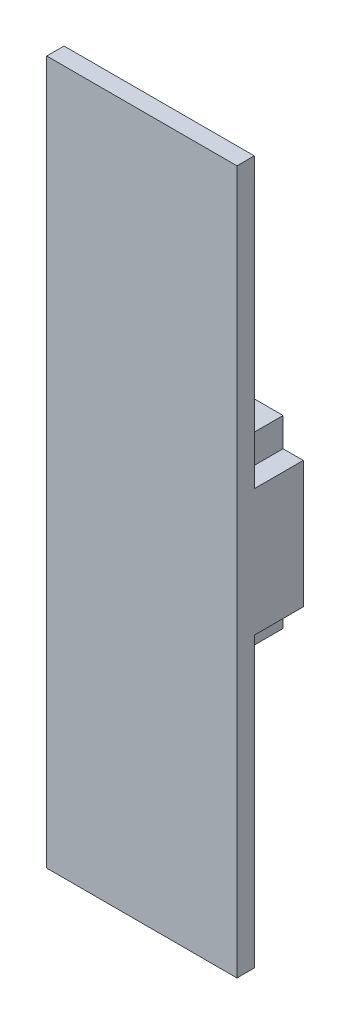
ISO-10303-21;
HEADER;
FILE_DESCRIPTION(('STEP AP214'),'2;1');
FILE_NAME('part.step','',(''),(''),'','','');
FILE_SCHEMA(('AUTOMOTIVE_DESIGN { 1 0 10303 214 1 1 1 1 }'));
ENDSEC;
DATA;
#1=APPLICATION_CONTEXT('core data for automotive mechanical design processes');
#2=APPLICATION_PROTOCOL_DEFINITION('international standard','automotive_design',2000,#1);
#3=PRODUCT_CONTEXT('',#1,'mechanical');
#4=PRODUCT('Part','Part','',(#3));
#5=PRODUCT_RELATED_PRODUCT_CATEGORY('part','',(#4));
#6=PRODUCT_DEFINITION_FORMATION('','',#4);
#7=PRODUCT_DEFINITION_CONTEXT('part definition',#1,'design');
#8=PRODUCT_DEFINITION('design','',#6,#7);
#9=PRODUCT_DEFINITION_SHAPE('','',#8);
#10=(LENGTH_UNIT() NAMED_UNIT(*) SI_UNIT(.MILLI.,.METRE.));
#11=(NAMED_UNIT(*) PLANE_ANGLE_UNIT() SI_UNIT($,.RADIAN.));
#12=(NAMED_UNIT(*) SI_UNIT($,.STERADIAN.) SOLID_ANGLE_UNIT());
#13=UNCERTAINTY_MEASURE_WITH_UNIT(LENGTH_MEASURE(1.E-05),#10,'distance_accuracy_value','');
#14=(GEOMETRIC_REPRESENTATION_CONTEXT(3) GLOBAL_UNCERTAINTY_ASSIGNED_CONTEXT((#13)) GLOBAL_UNIT_ASSIGNED_CONTEXT((#10,
#11,#12)) REPRESENTATION_CONTEXT('',''));
#15=CARTESIAN_POINT('',(0.,0.,0.));
#16=DIRECTION('',(0.,0.,1.));
#17=DIRECTION('',(1.,0.,0.));
#18=AXIS2_PLACEMENT_3D('',#15,#16,#17);
#19=CARTESIAN_POINT('',(0.,11.,2.5));
#20=DIRECTION('',(0.,1.,0.));
#21=DIRECTION('',(0.,0.,1.));
#22=AXIS2_PLACEMENT_3D('',#19,#20,#21);
#23=PLANE('',#22);
#24=DIRECTION('',(0.,0.,-1.));
#25=VECTOR('',#24,1.);
#26=CARTESIAN_POINT('',(-16.5,11.,2.5));
#27=LINE('',#26,#25);
#28=CARTESIAN_POINT('',(-16.5,11.,6.));
#29=VERTEX_POINT('',#28);
#30=CARTESIAN_POINT('',(-16.5,11.,-2.5));
#31=VERTEX_POINT('',#30);
#32=EDGE_CURVE('E41',#29,#31,#27,.T.);
#33=ORIENTED_EDGE('',*,*,#32,.F.);
#34=DIRECTION('',(-1.,0.,0.));
#35=VECTOR('',#34,1.);
#36=CARTESIAN_POINT('',(-16.5,11.,6.));
#37=LINE('',#36,#35);
#38=CARTESIAN_POINT('',(16.5,11.,6.));
#39=VERTEX_POINT('',#38);
#40=EDGE_CURVE('E709',#39,#29,#37,.T.);
#41=ORIENTED_EDGE('',*,*,#40,.F.);
#42=DIRECTION('',(0.,0.,-1.));
#43=VECTOR('',#42,1.);
#44=CARTESIAN_POINT('',(16.5,11.,2.5));
#45=LINE('',#44,#43);
#46=CARTESIAN_POINT('',(16.5,11.,-2.5));
#47=VERTEX_POINT('',#46);
#48=EDGE_CURVE('E258',#39,#47,#45,.T.);
#49=ORIENTED_EDGE('',*,*,#48,.T.);
#50=DIRECTION('',(1.,0.,0.));
#51=VECTOR('',#50,1.);
#52=CARTESIAN_POINT('',(0.,11.,-2.5));
#53=LINE('',#52,#51);
#54=CARTESIAN_POINT('',(13.,11.,-2.5));
#55=VERTEX_POINT('',#54);
#56=EDGE_CURVE('E206',#55,#47,#53,.T.);
#57=ORIENTED_EDGE('',*,*,#56,.F.);
#58=DIRECTION('',(0.,0.,-1.));
#59=VECTOR('',#58,1.);
#60=CARTESIAN_POINT('',(13.,11.,2.5));
#61=LINE('',#60,#59);
#62=CARTESIAN_POINT('',(13.,11.,2.5));
#63=VERTEX_POINT('',#62);
#64=EDGE_CURVE('E256',#63,#55,#61,.T.);
#65=ORIENTED_EDGE('',*,*,#64,.F.);
#66=DIRECTION('',(-1.,0.,0.));
#67=VECTOR('',#66,1.);
#68=CARTESIAN_POINT('',(-16.5,11.,2.5));
#69=LINE('',#68,#67);
#70=CARTESIAN_POINT('',(4.99999999999999,11.,2.5));
#71=VERTEX_POINT('',#70);
#72=EDGE_CURVE('E11',#63,#71,#69,.T.);
#73=ORIENTED_EDGE('',*,*,#72,.T.);
#74=DIRECTION('',(0.,0.,-1.));
#75=VECTOR('',#74,1.);
#76=CARTESIAN_POINT('',(4.99999999999999,11.,2.5));
#77=LINE('',#76,#75);
#78=CARTESIAN_POINT('',(4.99999999999999,11.,-2.5));
#79=VERTEX_POINT('',#78);
#80=EDGE_CURVE('E249',#71,#79,#77,.T.);
#81=ORIENTED_EDGE('',*,*,#80,.T.);
#82=CARTESIAN_POINT('',(-5.,11.,-2.5));
#83=VERTEX_POINT('',#82);
#84=EDGE_CURVE('E205',#83,#79,#53,.T.);
#85=ORIENTED_EDGE('',*,*,#84,.F.);
#86=DIRECTION('',(0.,0.,-1.));
#87=VECTOR('',#86,1.);
#88=CARTESIAN_POINT('',(-5.,11.,2.5));
#89=LINE('',#88,#87);
#90=CARTESIAN_POINT('',(-5.,11.,2.5));
#91=VERTEX_POINT('',#90);
#92=EDGE_CURVE('E188',#91,#83,#89,.T.);
#93=ORIENTED_EDGE('',*,*,#92,.F.);
#94=CARTESIAN_POINT('',(-13.,11.,2.5));
#95=VERTEX_POINT('',#94);
#96=EDGE_CURVE('E47',#91,#95,#69,.T.);
#97=ORIENTED_EDGE('',*,*,#96,.T.);
#98=DIRECTION('',(0.,0.,-1.));
#99=VECTOR('',#98,1.);
#100=CARTESIAN_POINT('',(-13.,11.,2.5));
#101=LINE('',#100,#99);
#102=CARTESIAN_POINT('',(-13.,11.,-2.5));
#103=VERTEX_POINT('',#102);
#104=EDGE_CURVE('E128',#95,#103,#101,.T.);
#105=ORIENTED_EDGE('',*,*,#104,.T.);
#106=EDGE_CURVE('E200',#31,#103,#53,.T.);
#107=ORIENTED_EDGE('',*,*,#106,.F.);
#108=EDGE_LOOP('',(#33,#41,#49,#57,#65,#73,#81,#85,#93,#97,#105,#107));
#109=FACE_BOUND('',#108,.T.);
#110=ADVANCED_FACE('F37',(#109),#23,.T.);
#111=CARTESIAN_POINT('',(0.,0.,2.5));
#112=DIRECTION('',(0.,0.,1.));
#113=DIRECTION('',(1.,0.,0.));
#114=AXIS2_PLACEMENT_3D('',#111,#112,#113);
#115=PLANE('',#114);
#116=ORIENTED_EDGE('',*,*,#72,.F.);
#117=DIRECTION('',(0.,-1.,0.));
#118=VECTOR('',#117,1.);
#119=CARTESIAN_POINT('',(13.,0.,2.5));
#120=LINE('',#119,#118);
#121=CARTESIAN_POINT('',(13.,16.,2.5));
#122=VERTEX_POINT('',#121);
#123=EDGE_CURVE('E309',#122,#63,#120,.T.);
#124=ORIENTED_EDGE('',*,*,#123,.F.);
#125=DIRECTION('',(-1.,0.,0.));
#126=VECTOR('',#125,1.);
#127=CARTESIAN_POINT('',(0.,16.,2.5));
#128=LINE('',#127,#126);
#129=CARTESIAN_POINT('',(4.99999999999999,16.,2.5));
#130=VERTEX_POINT('',#129);
#131=EDGE_CURVE('E312',#122,#130,#128,.T.);
#132=ORIENTED_EDGE('',*,*,#131,.T.);
#133=DIRECTION('',(0.,-1.,0.));
#134=VECTOR('',#133,1.);
#135=CARTESIAN_POINT('',(5.,0.,2.5));
#136=LINE('',#135,#134);
#137=EDGE_CURVE('E193',#130,#71,#136,.T.);
#138=ORIENTED_EDGE('',*,*,#137,.T.);
#139=EDGE_LOOP('',(#116,#124,#132,#138));
#140=FACE_BOUND('',#139,.T.);
#141=ADVANCED_FACE('F316',(#140),#115,.T.);
#142=ORIENTED_EDGE('',*,*,#96,.F.);
#143=DIRECTION('',(0.,-1.,0.));
#144=VECTOR('',#143,1.);
#145=CARTESIAN_POINT('',(-4.99999999999999,0.,2.5));
#146=LINE('',#145,#144);
#147=CARTESIAN_POINT('',(-5.,16.,2.5));
#148=VERTEX_POINT('',#147);
#149=EDGE_CURVE('E181',#148,#91,#146,.T.);
#150=ORIENTED_EDGE('',*,*,#149,.F.);
#151=DIRECTION('',(1.,0.,0.));
#152=VECTOR('',#151,1.);
#153=CARTESIAN_POINT('',(0.,16.,2.5));
#154=LINE('',#153,#152);
#155=CARTESIAN_POINT('',(-13.,16.,2.5));
#156=VERTEX_POINT('',#155);
#157=EDGE_CURVE('E191',#156,#148,#154,.T.);
#158=ORIENTED_EDGE('',*,*,#157,.F.);
#159=DIRECTION('',(0.,-1.,0.));
#160=VECTOR('',#159,1.);
#161=CARTESIAN_POINT('',(-13.,0.,2.5));
#162=LINE('',#161,#160);
#163=EDGE_CURVE('E56',#156,#95,#162,.T.);
#164=ORIENTED_EDGE('',*,*,#163,.T.);
#165=EDGE_LOOP('',(#142,#150,#158,#164));
#166=FACE_BOUND('',#165,.T.);
#167=ADVANCED_FACE('F190',(#166),#115,.T.);
#168=DIRECTION('',(1.,0.,0.));
#169=VECTOR('',#168,1.);
#170=CARTESIAN_POINT('',(-16.5,-11.,2.5));
#171=LINE('',#170,#169);
#172=CARTESIAN_POINT('',(-13.,-11.,2.5));
#173=VERTEX_POINT('',#172);
#174=CARTESIAN_POINT('',(-5.,-11.,2.5));
#175=VERTEX_POINT('',#174);
#176=EDGE_CURVE('E136',#173,#175,#171,.T.);
#177=ORIENTED_EDGE('',*,*,#176,.F.);
#178=DIRECTION('',(0.,1.,0.));
#179=VECTOR('',#178,1.);
#180=CARTESIAN_POINT('',(-13.,0.,2.5));
#181=LINE('',#180,#179);
#182=CARTESIAN_POINT('',(-13.,-16.,2.5));
#183=VERTEX_POINT('',#182);
#184=EDGE_CURVE('E245',#183,#173,#181,.T.);
#185=ORIENTED_EDGE('',*,*,#184,.F.);
#186=DIRECTION('',(1.,0.,0.));
#187=VECTOR('',#186,1.);
#188=CARTESIAN_POINT('',(0.,-16.,2.5));
#189=LINE('',#188,#187);
#190=CARTESIAN_POINT('',(-5.,-16.,2.5));
#191=VERTEX_POINT('',#190);
#192=EDGE_CURVE('E297',#183,#191,#189,.T.);
#193=ORIENTED_EDGE('',*,*,#192,.T.);
#194=DIRECTION('',(0.,1.,0.));
#195=VECTOR('',#194,1.);
#196=CARTESIAN_POINT('',(-4.99999999999999,0.,2.5));
#197=LINE('',#196,#195);
#198=EDGE_CURVE('E299',#191,#175,#197,.T.);
#199=ORIENTED_EDGE('',*,*,#198,.T.);
#200=EDGE_LOOP('',(#177,#185,#193,#199));
#201=FACE_BOUND('',#200,.T.);
#202=ADVANCED_FACE('F437',(#201),#115,.T.);
#203=CARTESIAN_POINT('',(-16.5,0.,2.5));
#204=DIRECTION('',(1.,0.,0.));
#205=DIRECTION('',(0.,1.,0.));
#206=AXIS2_PLACEMENT_3D('',#203,#204,#205);
#207=PLANE('',#206);
#208=DIRECTION('',(0.,-1.,0.));
#209=VECTOR('',#208,1.);
#210=CARTESIAN_POINT('',(-16.5,0.,-2.5));
#211=LINE('',#210,#209);
#212=CARTESIAN_POINT('',(-16.5,-11.,-2.5));
#213=VERTEX_POINT('',#212);
#214=EDGE_CURVE('E203',#31,#213,#211,.T.);
#215=ORIENTED_EDGE('',*,*,#214,.T.);
#216=DIRECTION('',(0.,0.,-1.));
#217=VECTOR('',#216,1.);
#218=CARTESIAN_POINT('',(-16.5,-11.,2.5));
#219=LINE('',#218,#217);
#220=CARTESIAN_POINT('',(-16.5,-11.,6.));
#221=VERTEX_POINT('',#220);
#222=EDGE_CURVE('E280',#221,#213,#219,.T.);
#223=ORIENTED_EDGE('',*,*,#222,.F.);
#224=DIRECTION('',(0.,1.,0.));
#225=VECTOR('',#224,1.);
#226=CARTESIAN_POINT('',(-16.5,-61.,6.));
#227=LINE('',#226,#225);
#228=CARTESIAN_POINT('',(-16.5,-61.,6.));
#229=VERTEX_POINT('',#228);
#230=EDGE_CURVE('E741',#229,#221,#227,.T.);
#231=ORIENTED_EDGE('',*,*,#230,.F.);
#232=DIRECTION('',(0.,0.,1.));
#233=VECTOR('',#232,1.);
#234=CARTESIAN_POINT('',(-16.5,-61.,9.));
#235=LINE('',#234,#233);
#236=CARTESIAN_POINT('',(-16.5,-61.,9.));
#237=VERTEX_POINT('',#236);
#238=EDGE_CURVE('E743',#229,#237,#235,.T.);
#239=ORIENTED_EDGE('',*,*,#238,.T.);
#240=DIRECTION('',(0.,-1.,0.));
#241=VECTOR('',#240,1.);
#242=CARTESIAN_POINT('',(-16.5,11.,9.));
#243=LINE('',#242,#241);
#244=CARTESIAN_POINT('',(-16.5,61.,9.));
#245=VERTEX_POINT('',#244);
#246=EDGE_CURVE('E774',#245,#237,#243,.T.);
#247=ORIENTED_EDGE('',*,*,#246,.F.);
#248=DIRECTION('',(0.,0.,1.));
#249=VECTOR('',#248,1.);
#250=CARTESIAN_POINT('',(-16.5,61.,9.));
#251=LINE('',#250,#249);
#252=CARTESIAN_POINT('',(-16.5,61.,6.));
#253=VERTEX_POINT('',#252);
#254=EDGE_CURVE('E761',#253,#245,#251,.T.);
#255=ORIENTED_EDGE('',*,*,#254,.F.);
#256=DIRECTION('',(0.,-1.,0.));
#257=VECTOR('',#256,1.);
#258=CARTESIAN_POINT('',(-16.5,61.,6.));
#259=LINE('',#258,#257);
#260=EDGE_CURVE('E771',#253,#29,#259,.T.);
#261=ORIENTED_EDGE('',*,*,#260,.T.);
#262=ORIENTED_EDGE('',*,*,#32,.T.);
#263=EDGE_LOOP('',(#215,#223,#231,#239,#247,#255,#261,#262));
#264=FACE_BOUND('',#263,.T.);
#265=ADVANCED_FACE('F39',(#264),#207,.F.);
#266=CARTESIAN_POINT('',(-13.,0.,2.5));
#267=DIRECTION('',(-1.,0.,0.));
#268=DIRECTION('',(0.,0.,1.));
#269=AXIS2_PLACEMENT_3D('',#266,#267,#268);
#270=PLANE('',#269);
#271=DIRECTION('',(0.,1.,0.));
#272=VECTOR('',#271,1.);
#273=CARTESIAN_POINT('',(-13.,0.,-2.5));
#274=LINE('',#273,#272);
#275=CARTESIAN_POINT('',(-13.,-16.,-2.5));
#276=VERTEX_POINT('',#275);
#277=CARTESIAN_POINT('',(-13.,-11.,-2.5));
#278=VERTEX_POINT('',#277);
#279=EDGE_CURVE('E212',#276,#278,#274,.T.);
#280=ORIENTED_EDGE('',*,*,#279,.F.);
#281=DIRECTION('',(0.,0.,-1.));
#282=VECTOR('',#281,1.);
#283=CARTESIAN_POINT('',(-13.,-16.,2.5));
#284=LINE('',#283,#282);
#285=EDGE_CURVE('E277',#183,#276,#284,.T.);
#286=ORIENTED_EDGE('',*,*,#285,.F.);
#287=ORIENTED_EDGE('',*,*,#184,.T.);
#288=DIRECTION('',(0.,0.,-1.));
#289=VECTOR('',#288,1.);
#290=CARTESIAN_POINT('',(-13.,-11.,2.5));
#291=LINE('',#290,#289);
#292=EDGE_CURVE('E279',#173,#278,#291,.T.);
#293=ORIENTED_EDGE('',*,*,#292,.T.);
#294=EDGE_LOOP('',(#280,#286,#287,#293));
#295=FACE_BOUND('',#294,.T.);
#296=ADVANCED_FACE('F506',(#295),#270,.T.);
#297=CARTESIAN_POINT('',(0.,-16.,2.5));
#298=DIRECTION('',(0.,1.,0.));
#299=DIRECTION('',(-1.,0.,0.));
#300=AXIS2_PLACEMENT_3D('',#297,#298,#299);
#301=PLANE('',#300);
#302=DIRECTION('',(1.,0.,0.));
#303=VECTOR('',#302,1.);
#304=CARTESIAN_POINT('',(0.,-16.,-2.5));
#305=LINE('',#304,#303);
#306=CARTESIAN_POINT('',(-5.,-16.,-2.5));
#307=VERTEX_POINT('',#306);
#308=EDGE_CURVE('E217',#276,#307,#305,.T.);
#309=ORIENTED_EDGE('',*,*,#308,.T.);
#310=DIRECTION('',(0.,0.,-1.));
#311=VECTOR('',#310,1.);
#312=CARTESIAN_POINT('',(-5.,-16.,2.5));
#313=LINE('',#312,#311);
#314=EDGE_CURVE('E274',#191,#307,#313,.T.);
#315=ORIENTED_EDGE('',*,*,#314,.F.);
#316=ORIENTED_EDGE('',*,*,#192,.F.);
#317=ORIENTED_EDGE('',*,*,#285,.T.);
#318=EDGE_LOOP('',(#309,#315,#316,#317));
#319=FACE_BOUND('',#318,.T.);
#320=ADVANCED_FACE('F662',(#319),#301,.F.);
#321=CARTESIAN_POINT('',(-4.99999999999999,0.,2.5));
#322=DIRECTION('',(-1.,0.,0.));
#323=DIRECTION('',(0.,-1.,0.));
#324=AXIS2_PLACEMENT_3D('',#321,#322,#323);
#325=PLANE('',#324);
#326=DIRECTION('',(0.,1.,0.));
#327=VECTOR('',#326,1.);
#328=CARTESIAN_POINT('',(-4.99999999999999,0.,-2.5));
#329=LINE('',#328,#327);
#330=CARTESIAN_POINT('',(-5.,-11.,-2.5));
#331=VERTEX_POINT('',#330);
#332=EDGE_CURVE('E219',#307,#331,#329,.T.);
#333=ORIENTED_EDGE('',*,*,#332,.T.);
#334=DIRECTION('',(0.,0.,-1.));
#335=VECTOR('',#334,1.);
#336=CARTESIAN_POINT('',(-5.,-11.,2.5));
#337=LINE('',#336,#335);
#338=EDGE_CURVE('E271',#175,#331,#337,.T.);
#339=ORIENTED_EDGE('',*,*,#338,.F.);
#340=ORIENTED_EDGE('',*,*,#198,.F.);
#341=ORIENTED_EDGE('',*,*,#314,.T.);
#342=EDGE_LOOP('',(#333,#339,#340,#341));
#343=FACE_BOUND('',#342,.T.);
#344=ADVANCED_FACE('F669',(#343),#325,.F.);
#345=CARTESIAN_POINT('',(5.,0.,2.5));
#346=DIRECTION('',(-1.,0.,0.));
#347=DIRECTION('',(0.,-1.,0.));
#348=AXIS2_PLACEMENT_3D('',#345,#346,#347);
#349=PLANE('',#348);
#350=DIRECTION('',(0.,1.,0.));
#351=VECTOR('',#350,1.);
#352=CARTESIAN_POINT('',(5.,0.,-2.5));
#353=LINE('',#352,#351);
#354=CARTESIAN_POINT('',(4.99999999999999,-16.,-2.5));
#355=VERTEX_POINT('',#354);
#356=CARTESIAN_POINT('',(5.,-11.,-2.5));
#357=VERTEX_POINT('',#356);
#358=EDGE_CURVE('E221',#355,#357,#353,.T.);
#359=ORIENTED_EDGE('',*,*,#358,.F.);
#360=DIRECTION('',(0.,0.,-1.));
#361=VECTOR('',#360,1.);
#362=CARTESIAN_POINT('',(4.99999999999999,-16.,2.5));
#363=LINE('',#362,#361);
#364=CARTESIAN_POINT('',(4.99999999999999,-16.,2.5));
#365=VERTEX_POINT('',#364);
#366=EDGE_CURVE('E267',#365,#355,#363,.T.);
#367=ORIENTED_EDGE('',*,*,#366,.F.);
#368=DIRECTION('',(0.,1.,0.));
#369=VECTOR('',#368,1.);
#370=CARTESIAN_POINT('',(5.,0.,2.5));
#371=LINE('',#370,#369);
#372=CARTESIAN_POINT('',(5.,-11.,2.5));
#373=VERTEX_POINT('',#372);
#374=EDGE_CURVE('E301',#365,#373,#371,.T.);
#375=ORIENTED_EDGE('',*,*,#374,.T.);
#376=DIRECTION('',(0.,0.,-1.));
#377=VECTOR('',#376,1.);
#378=CARTESIAN_POINT('',(5.,-11.,2.5));
#379=LINE('',#378,#377);
#380=EDGE_CURVE('E269',#373,#357,#379,.T.);
#381=ORIENTED_EDGE('',*,*,#380,.T.);
#382=EDGE_LOOP('',(#359,#367,#375,#381));
#383=FACE_BOUND('',#382,.T.);
#384=ADVANCED_FACE('F361',(#383),#349,.T.);
#385=CARTESIAN_POINT('',(0.,-16.,2.5));
#386=DIRECTION('',(0.,-1.,0.));
#387=DIRECTION('',(0.,0.,-1.));
#388=AXIS2_PLACEMENT_3D('',#385,#386,#387);
#389=PLANE('',#388);
#390=DIRECTION('',(-1.,0.,0.));
#391=VECTOR('',#390,1.);
#392=CARTESIAN_POINT('',(0.,-16.,-2.5));
#393=LINE('',#392,#391);
#394=CARTESIAN_POINT('',(13.,-16.,-2.5));
#395=VERTEX_POINT('',#394);
#396=EDGE_CURVE('E224',#395,#355,#393,.T.);
#397=ORIENTED_EDGE('',*,*,#396,.F.);
#398=DIRECTION('',(0.,0.,-1.));
#399=VECTOR('',#398,1.);
#400=CARTESIAN_POINT('',(13.,-16.,2.5));
#401=LINE('',#400,#399);
#402=CARTESIAN_POINT('',(13.,-16.,2.5));
#403=VERTEX_POINT('',#402);
#404=EDGE_CURVE('E265',#403,#395,#401,.T.);
#405=ORIENTED_EDGE('',*,*,#404,.F.);
#406=DIRECTION('',(-1.,0.,0.));
#407=VECTOR('',#406,1.);
#408=CARTESIAN_POINT('',(0.,-16.,2.5));
#409=LINE('',#408,#407);
#410=EDGE_CURVE('E304',#403,#365,#409,.T.);
#411=ORIENTED_EDGE('',*,*,#410,.T.);
#412=ORIENTED_EDGE('',*,*,#366,.T.);
#413=EDGE_LOOP('',(#397,#405,#411,#412));
#414=FACE_BOUND('',#413,.T.);
#415=ADVANCED_FACE('F367',(#414),#389,.T.);
#416=CARTESIAN_POINT('',(13.,0.,2.5));
#417=DIRECTION('',(-1.,0.,0.));
#418=DIRECTION('',(0.,-1.,0.));
#419=AXIS2_PLACEMENT_3D('',#416,#417,#418);
#420=PLANE('',#419);
#421=DIRECTION('',(0.,1.,0.));
#422=VECTOR('',#421,1.);
#423=CARTESIAN_POINT('',(13.,0.,-2.5));
#424=LINE('',#423,#422);
#425=CARTESIAN_POINT('',(13.,-11.,-2.5));
#426=VERTEX_POINT('',#425);
#427=EDGE_CURVE('E227',#395,#426,#424,.T.);
#428=ORIENTED_EDGE('',*,*,#427,.T.);
#429=DIRECTION('',(0.,0.,-1.));
#430=VECTOR('',#429,1.);
#431=CARTESIAN_POINT('',(13.,-11.,2.5));
#432=LINE('',#431,#430);
#433=CARTESIAN_POINT('',(13.,-11.,2.5));
#434=VERTEX_POINT('',#433);
#435=EDGE_CURVE('E262',#434,#426,#432,.T.);
#436=ORIENTED_EDGE('',*,*,#435,.F.);
#437=DIRECTION('',(0.,1.,0.));
#438=VECTOR('',#437,1.);
#439=CARTESIAN_POINT('',(13.,0.,2.5));
#440=LINE('',#439,#438);
#441=EDGE_CURVE('E307',#403,#434,#440,.T.);
#442=ORIENTED_EDGE('',*,*,#441,.F.);
#443=ORIENTED_EDGE('',*,*,#404,.T.);
#444=EDGE_LOOP('',(#428,#436,#442,#443));
#445=FACE_BOUND('',#444,.T.);
#446=ADVANCED_FACE('F370',(#445),#420,.F.);
#447=CARTESIAN_POINT('',(0.,-11.,2.5));
#448=DIRECTION('',(0.,1.,0.));
#449=DIRECTION('',(0.,0.,1.));
#450=AXIS2_PLACEMENT_3D('',#447,#448,#449);
#451=PLANE('',#450);
#452=DIRECTION('',(0.,0.,-1.));
#453=VECTOR('',#452,1.);
#454=CARTESIAN_POINT('',(16.5,-11.,2.5));
#455=LINE('',#454,#453);
#456=CARTESIAN_POINT('',(16.5,-11.,6.));
#457=VERTEX_POINT('',#456);
#458=CARTESIAN_POINT('',(16.5,-11.,-2.5));
#459=VERTEX_POINT('',#458);
#460=EDGE_CURVE('E260',#457,#459,#455,.T.);
#461=ORIENTED_EDGE('',*,*,#460,.F.);
#462=DIRECTION('',(-1.,0.,0.));
#463=VECTOR('',#462,1.);
#464=CARTESIAN_POINT('',(-16.5,-11.,6.));
#465=LINE('',#464,#463);
#466=EDGE_CURVE('E752',#457,#221,#465,.T.);
#467=ORIENTED_EDGE('',*,*,#466,.T.);
#468=ORIENTED_EDGE('',*,*,#222,.T.);
#469=DIRECTION('',(1.,0.,0.));
#470=VECTOR('',#469,1.);
#471=CARTESIAN_POINT('',(0.,-11.,-2.5));
#472=LINE('',#471,#470);
#473=EDGE_CURVE('E209',#213,#278,#472,.T.);
#474=ORIENTED_EDGE('',*,*,#473,.T.);
#475=ORIENTED_EDGE('',*,*,#292,.F.);
#476=ORIENTED_EDGE('',*,*,#176,.T.);
#477=ORIENTED_EDGE('',*,*,#338,.T.);
#478=EDGE_CURVE('E214',#331,#357,#472,.T.);
#479=ORIENTED_EDGE('',*,*,#478,.T.);
#480=ORIENTED_EDGE('',*,*,#380,.F.);
#481=EDGE_CURVE('E284',#373,#434,#171,.T.);
#482=ORIENTED_EDGE('',*,*,#481,.T.);
#483=ORIENTED_EDGE('',*,*,#435,.T.);
#484=EDGE_CURVE('E213',#426,#459,#472,.T.);
#485=ORIENTED_EDGE('',*,*,#484,.T.);
#486=EDGE_LOOP('',(#461,#467,#468,#474,#475,#476,#477,#479,#480,#482,#483,#485));
#487=FACE_BOUND('',#486,.T.);
#488=ADVANCED_FACE('F352',(#487),#451,.F.);
#489=CARTESIAN_POINT('',(16.5,0.,2.5));
#490=DIRECTION('',(1.,0.,0.));
#491=DIRECTION('',(0.,1.,0.));
#492=AXIS2_PLACEMENT_3D('',#489,#490,#491);
#493=PLANE('',#492);
#494=DIRECTION('',(0.,-1.,0.));
#495=VECTOR('',#494,1.);
#496=CARTESIAN_POINT('',(16.5,0.,-2.5));
#497=LINE('',#496,#495);
#498=EDGE_CURVE('E229',#47,#459,#497,.T.);
#499=ORIENTED_EDGE('',*,*,#498,.F.);
#500=ORIENTED_EDGE('',*,*,#48,.F.);
#501=DIRECTION('',(0.,-1.,0.));
#502=VECTOR('',#501,1.);
#503=CARTESIAN_POINT('',(16.5,61.,6.));
#504=LINE('',#503,#502);
#505=CARTESIAN_POINT('',(16.5,61.,6.));
#506=VERTEX_POINT('',#505);
#507=EDGE_CURVE('E718',#506,#39,#504,.T.);
#508=ORIENTED_EDGE('',*,*,#507,.F.);
#509=DIRECTION('',(0.,0.,-1.));
#510=VECTOR('',#509,1.);
#511=CARTESIAN_POINT('',(16.5,61.,9.));
#512=LINE('',#511,#510);
#513=CARTESIAN_POINT('',(16.5,61.,9.));
#514=VERTEX_POINT('',#513);
#515=EDGE_CURVE('E767',#514,#506,#512,.T.);
#516=ORIENTED_EDGE('',*,*,#515,.F.);
#517=DIRECTION('',(0.,1.,0.));
#518=VECTOR('',#517,1.);
#519=CARTESIAN_POINT('',(16.5,11.,9.));
#520=LINE('',#519,#518);
#521=CARTESIAN_POINT('',(16.5,-61.,9.));
#522=VERTEX_POINT('',#521);
#523=EDGE_CURVE('E204',#522,#514,#520,.T.);
#524=ORIENTED_EDGE('',*,*,#523,.F.);
#525=DIRECTION('',(0.,0.,-1.));
#526=VECTOR('',#525,1.);
#527=CARTESIAN_POINT('',(16.5,-61.,9.));
#528=LINE('',#527,#526);
#529=CARTESIAN_POINT('',(16.5,-61.,6.));
#530=VERTEX_POINT('',#529);
#531=EDGE_CURVE('E754',#522,#530,#528,.T.);
#532=ORIENTED_EDGE('',*,*,#531,.T.);
#533=DIRECTION('',(0.,1.,0.));
#534=VECTOR('',#533,1.);
#535=CARTESIAN_POINT('',(16.5,-61.,6.));
#536=LINE('',#535,#534);
#537=EDGE_CURVE('E350',#530,#457,#536,.T.);
#538=ORIENTED_EDGE('',*,*,#537,.T.);
#539=ORIENTED_EDGE('',*,*,#460,.T.);
#540=EDGE_LOOP('',(#499,#500,#508,#516,#524,#532,#538,#539));
#541=FACE_BOUND('',#540,.T.);
#542=ADVANCED_FACE('F342',(#541),#493,.T.);
#543=CARTESIAN_POINT('',(13.,0.,2.5));
#544=DIRECTION('',(1.,0.,0.));
#545=DIRECTION('',(0.,1.,0.));
#546=AXIS2_PLACEMENT_3D('',#543,#544,#545);
#547=PLANE('',#546);
#548=DIRECTION('',(0.,-1.,0.));
#549=VECTOR('',#548,1.);
#550=CARTESIAN_POINT('',(13.,0.,-2.5));
#551=LINE('',#550,#549);
#552=CARTESIAN_POINT('',(13.,16.,-2.5));
#553=VERTEX_POINT('',#552);
#554=EDGE_CURVE('E232',#553,#55,#551,.T.);
#555=ORIENTED_EDGE('',*,*,#554,.F.);
#556=DIRECTION('',(0.,0.,-1.));
#557=VECTOR('',#556,1.);
#558=CARTESIAN_POINT('',(13.,16.,2.5));
#559=LINE('',#558,#557);
#560=EDGE_CURVE('E254',#122,#553,#559,.T.);
#561=ORIENTED_EDGE('',*,*,#560,.F.);
#562=ORIENTED_EDGE('',*,*,#123,.T.);
#563=ORIENTED_EDGE('',*,*,#64,.T.);
#564=EDGE_LOOP('',(#555,#561,#562,#563));
#565=FACE_BOUND('',#564,.T.);
#566=ADVANCED_FACE('F330',(#565),#547,.T.);
#567=CARTESIAN_POINT('',(0.,16.,2.5));
#568=DIRECTION('',(0.,-1.,0.));
#569=DIRECTION('',(1.,0.,0.));
#570=AXIS2_PLACEMENT_3D('',#567,#568,#569);
#571=PLANE('',#570);
#572=DIRECTION('',(-1.,0.,0.));
#573=VECTOR('',#572,1.);
#574=CARTESIAN_POINT('',(0.,16.,-2.5));
#575=LINE('',#574,#573);
#576=CARTESIAN_POINT('',(4.99999999999999,16.,-2.5));
#577=VERTEX_POINT('',#576);
#578=EDGE_CURVE('E235',#553,#577,#575,.T.);
#579=ORIENTED_EDGE('',*,*,#578,.T.);
#580=DIRECTION('',(0.,0.,-1.));
#581=VECTOR('',#580,1.);
#582=CARTESIAN_POINT('',(4.99999999999999,16.,2.5));
#583=LINE('',#582,#581);
#584=EDGE_CURVE('E251',#130,#577,#583,.T.);
#585=ORIENTED_EDGE('',*,*,#584,.F.);
#586=ORIENTED_EDGE('',*,*,#131,.F.);
#587=ORIENTED_EDGE('',*,*,#560,.T.);
#588=EDGE_LOOP('',(#579,#585,#586,#587));
#589=FACE_BOUND('',#588,.T.);
#590=ADVANCED_FACE('F333',(#589),#571,.F.);
#591=CARTESIAN_POINT('',(5.,0.,2.5));
#592=DIRECTION('',(1.,0.,0.));
#593=DIRECTION('',(0.,1.,0.));
#594=AXIS2_PLACEMENT_3D('',#591,#592,#593);
#595=PLANE('',#594);
#596=DIRECTION('',(0.,-1.,0.));
#597=VECTOR('',#596,1.);
#598=CARTESIAN_POINT('',(5.,0.,-2.5));
#599=LINE('',#598,#597);
#600=EDGE_CURVE('E237',#577,#79,#599,.T.);
#601=ORIENTED_EDGE('',*,*,#600,.T.);
#602=ORIENTED_EDGE('',*,*,#80,.F.);
#603=ORIENTED_EDGE('',*,*,#137,.F.);
#604=ORIENTED_EDGE('',*,*,#584,.T.);
#605=EDGE_LOOP('',(#601,#602,#603,#604));
#606=FACE_BOUND('',#605,.T.);
#607=ADVANCED_FACE('F322',(#606),#595,.F.);
#608=CARTESIAN_POINT('',(-4.99999999999999,0.,2.5));
#609=DIRECTION('',(1.,0.,0.));
#610=DIRECTION('',(0.,1.,0.));
#611=AXIS2_PLACEMENT_3D('',#608,#609,#610);
#612=PLANE('',#611);
#613=DIRECTION('',(0.,-1.,0.));
#614=VECTOR('',#613,1.);
#615=CARTESIAN_POINT('',(-4.99999999999999,0.,-2.5));
#616=LINE('',#615,#614);
#617=CARTESIAN_POINT('',(-5.,16.,-2.5));
#618=VERTEX_POINT('',#617);
#619=EDGE_CURVE('E183',#618,#83,#616,.T.);
#620=ORIENTED_EDGE('',*,*,#619,.F.);
#621=DIRECTION('',(0.,0.,-1.));
#622=VECTOR('',#621,1.);
#623=CARTESIAN_POINT('',(-5.,16.,2.5));
#624=LINE('',#623,#622);
#625=EDGE_CURVE('E178',#148,#618,#624,.T.);
#626=ORIENTED_EDGE('',*,*,#625,.F.);
#627=ORIENTED_EDGE('',*,*,#149,.T.);
#628=ORIENTED_EDGE('',*,*,#92,.T.);
#629=EDGE_LOOP('',(#620,#626,#627,#628));
#630=FACE_BOUND('',#629,.T.);
#631=ADVANCED_FACE('F180',(#630),#612,.T.);
#632=CARTESIAN_POINT('',(0.,16.,2.5));
#633=DIRECTION('',(0.,1.,0.));
#634=DIRECTION('',(0.,0.,1.));
#635=AXIS2_PLACEMENT_3D('',#632,#633,#634);
#636=PLANE('',#635);
#637=DIRECTION('',(1.,0.,0.));
#638=VECTOR('',#637,1.);
#639=CARTESIAN_POINT('',(0.,16.,-2.5));
#640=LINE('',#639,#638);
#641=CARTESIAN_POINT('',(-13.,16.,-2.5));
#642=VERTEX_POINT('',#641);
#643=EDGE_CURVE('E241',#642,#618,#640,.T.);
#644=ORIENTED_EDGE('',*,*,#643,.F.);
#645=DIRECTION('',(0.,0.,-1.));
#646=VECTOR('',#645,1.);
#647=CARTESIAN_POINT('',(-13.,16.,2.5));
#648=LINE('',#647,#646);
#649=EDGE_CURVE('E121',#156,#642,#648,.T.);
#650=ORIENTED_EDGE('',*,*,#649,.F.);
#651=ORIENTED_EDGE('',*,*,#157,.T.);
#652=ORIENTED_EDGE('',*,*,#625,.T.);
#653=EDGE_LOOP('',(#644,#650,#651,#652));
#654=FACE_BOUND('',#653,.T.);
#655=ADVANCED_FACE('F195',(#654),#636,.T.);
#656=CARTESIAN_POINT('',(-13.,0.,2.5));
#657=DIRECTION('',(1.,0.,0.));
#658=DIRECTION('',(0.,0.,-1.));
#659=AXIS2_PLACEMENT_3D('',#656,#657,#658);
#660=PLANE('',#659);
#661=DIRECTION('',(0.,-1.,0.));
#662=VECTOR('',#661,1.);
#663=CARTESIAN_POINT('',(-13.,0.,-2.5));
#664=LINE('',#663,#662);
#665=EDGE_CURVE('E243',#642,#103,#664,.T.);
#666=ORIENTED_EDGE('',*,*,#665,.T.);
#667=ORIENTED_EDGE('',*,*,#104,.F.);
#668=ORIENTED_EDGE('',*,*,#163,.F.);
#669=ORIENTED_EDGE('',*,*,#649,.T.);
#670=EDGE_LOOP('',(#666,#667,#668,#669));
#671=FACE_BOUND('',#670,.T.);
#672=ADVANCED_FACE('F425',(#671),#660,.F.);
#673=ORIENTED_EDGE('',*,*,#481,.F.);
#674=ORIENTED_EDGE('',*,*,#374,.F.);
#675=ORIENTED_EDGE('',*,*,#410,.F.);
#676=ORIENTED_EDGE('',*,*,#441,.T.);
#677=EDGE_LOOP('',(#673,#674,#675,#676));
#678=FACE_BOUND('',#677,.T.);
#679=ADVANCED_FACE('F365',(#678),#115,.T.);
#680=CARTESIAN_POINT('',(0.,0.,-2.5));
#681=DIRECTION('',(0.,0.,1.));
#682=DIRECTION('',(1.,0.,0.));
#683=AXIS2_PLACEMENT_3D('',#680,#681,#682);
#684=PLANE('',#683);
#685=ORIENTED_EDGE('',*,*,#106,.T.);
#686=ORIENTED_EDGE('',*,*,#665,.F.);
#687=ORIENTED_EDGE('',*,*,#643,.T.);
#688=ORIENTED_EDGE('',*,*,#619,.T.);
#689=ORIENTED_EDGE('',*,*,#84,.T.);
#690=ORIENTED_EDGE('',*,*,#600,.F.);
#691=ORIENTED_EDGE('',*,*,#578,.F.);
#692=ORIENTED_EDGE('',*,*,#554,.T.);
#693=ORIENTED_EDGE('',*,*,#56,.T.);
#694=ORIENTED_EDGE('',*,*,#498,.T.);
#695=ORIENTED_EDGE('',*,*,#484,.F.);
#696=ORIENTED_EDGE('',*,*,#427,.F.);
#697=ORIENTED_EDGE('',*,*,#396,.T.);
#698=ORIENTED_EDGE('',*,*,#358,.T.);
#699=ORIENTED_EDGE('',*,*,#478,.F.);
#700=ORIENTED_EDGE('',*,*,#332,.F.);
#701=ORIENTED_EDGE('',*,*,#308,.F.);
#702=ORIENTED_EDGE('',*,*,#279,.T.);
#703=ORIENTED_EDGE('',*,*,#473,.F.);
#704=ORIENTED_EDGE('',*,*,#214,.F.);
#705=EDGE_LOOP('',(#685,#686,#687,#688,#689,#690,#691,#692,#693,#694,#695,#696,#697,#698,#699,
#700,#701,#702,#703,#704));
#706=FACE_BOUND('',#705,.T.);
#707=ADVANCED_FACE('F335',(#706),#684,.F.);
#708=CARTESIAN_POINT('',(0.,0.,9.));
#709=DIRECTION('',(0.,0.,1.));
#710=DIRECTION('',(1.,0.,0.));
#711=AXIS2_PLACEMENT_3D('',#708,#709,#710);
#712=PLANE('',#711);
#713=ORIENTED_EDGE('',*,*,#246,.T.);
#714=DIRECTION('',(1.,0.,0.));
#715=VECTOR('',#714,1.);
#716=CARTESIAN_POINT('',(-16.5,-61.,9.));
#717=LINE('',#716,#715);
#718=EDGE_CURVE('E751',#237,#522,#717,.T.);
#719=ORIENTED_EDGE('',*,*,#718,.T.);
#720=ORIENTED_EDGE('',*,*,#523,.T.);
#721=DIRECTION('',(1.,0.,0.));
#722=VECTOR('',#721,1.);
#723=CARTESIAN_POINT('',(-16.5,61.,9.));
#724=LINE('',#723,#722);
#725=EDGE_CURVE('E764',#245,#514,#724,.T.);
#726=ORIENTED_EDGE('',*,*,#725,.F.);
#727=EDGE_LOOP('',(#713,#719,#720,#726));
#728=FACE_BOUND('',#727,.T.);
#729=ADVANCED_FACE('F442',(#728),#712,.T.);
#730=CARTESIAN_POINT('',(-16.5,61.,6.));
#731=DIRECTION('',(0.,0.,1.));
#732=DIRECTION('',(1.,0.,0.));
#733=AXIS2_PLACEMENT_3D('',#730,#731,#732);
#734=PLANE('',#733);
#735=ORIENTED_EDGE('',*,*,#40,.T.);
#736=ORIENTED_EDGE('',*,*,#260,.F.);
#737=DIRECTION('',(-1.,0.,0.));
#738=VECTOR('',#737,1.);
#739=CARTESIAN_POINT('',(-16.5,61.,6.));
#740=LINE('',#739,#738);
#741=EDGE_CURVE('E769',#506,#253,#740,.T.);
#742=ORIENTED_EDGE('',*,*,#741,.F.);
#743=ORIENTED_EDGE('',*,*,#507,.T.);
#744=EDGE_LOOP('',(#735,#736,#742,#743));
#745=FACE_BOUND('',#744,.T.);
#746=ADVANCED_FACE('F449',(#745),#734,.F.);
#747=CARTESIAN_POINT('',(0.,61.,0.));
#748=DIRECTION('',(0.,-1.,0.));
#749=DIRECTION('',(0.,0.,-1.));
#750=AXIS2_PLACEMENT_3D('',#747,#748,#749);
#751=PLANE('',#750);
#752=ORIENTED_EDGE('',*,*,#254,.T.);
#753=ORIENTED_EDGE('',*,*,#725,.T.);
#754=ORIENTED_EDGE('',*,*,#515,.T.);
#755=ORIENTED_EDGE('',*,*,#741,.T.);
#756=EDGE_LOOP('',(#752,#753,#754,#755));
#757=FACE_BOUND('',#756,.T.);
#758=ADVANCED_FACE('F458',(#757),#751,.F.);
#759=CARTESIAN_POINT('',(-16.5,-61.,6.));
#760=DIRECTION('',(0.,0.,-1.));
#761=DIRECTION('',(-1.,0.,0.));
#762=AXIS2_PLACEMENT_3D('',#759,#760,#761);
#763=PLANE('',#762);
#764=ORIENTED_EDGE('',*,*,#466,.F.);
#765=ORIENTED_EDGE('',*,*,#537,.F.);
#766=DIRECTION('',(-1.,0.,0.));
#767=VECTOR('',#766,1.);
#768=CARTESIAN_POINT('',(-16.5,-61.,6.));
#769=LINE('',#768,#767);
#770=EDGE_CURVE('E749',#530,#229,#769,.T.);
#771=ORIENTED_EDGE('',*,*,#770,.T.);
#772=ORIENTED_EDGE('',*,*,#230,.T.);
#773=EDGE_LOOP('',(#764,#765,#771,#772));
#774=FACE_BOUND('',#773,.T.);
#775=ADVANCED_FACE('F466',(#774),#763,.T.);
#776=CARTESIAN_POINT('',(0.,-61.,0.));
#777=DIRECTION('',(0.,1.,0.));
#778=DIRECTION('',(0.,0.,-1.));
#779=AXIS2_PLACEMENT_3D('',#776,#777,#778);
#780=PLANE('',#779);
#781=ORIENTED_EDGE('',*,*,#238,.F.);
#782=ORIENTED_EDGE('',*,*,#770,.F.);
#783=ORIENTED_EDGE('',*,*,#531,.F.);
#784=ORIENTED_EDGE('',*,*,#718,.F.);
#785=EDGE_LOOP('',(#781,#782,#783,#784));
#786=FACE_BOUND('',#785,.T.);
#787=ADVANCED_FACE('F474',(#786),#780,.F.);
#788=CLOSED_SHELL('',(#110,#141,#167,#202,#265,#296,#320,#344,#384,#415,#446,#488,#542,#566,
#590,#607,#631,#655,#672,#679,#707,#729,#746,#758,#775,#787));
#789=MANIFOLD_SOLID_BREP('B2',#788);
#790=ADVANCED_BREP_SHAPE_REPRESENTATION('',(#18,#789),#14);
#791=SHAPE_DEFINITION_REPRESENTATION(#9,#790);
ENDSEC;
END-ISO-10303-21;
